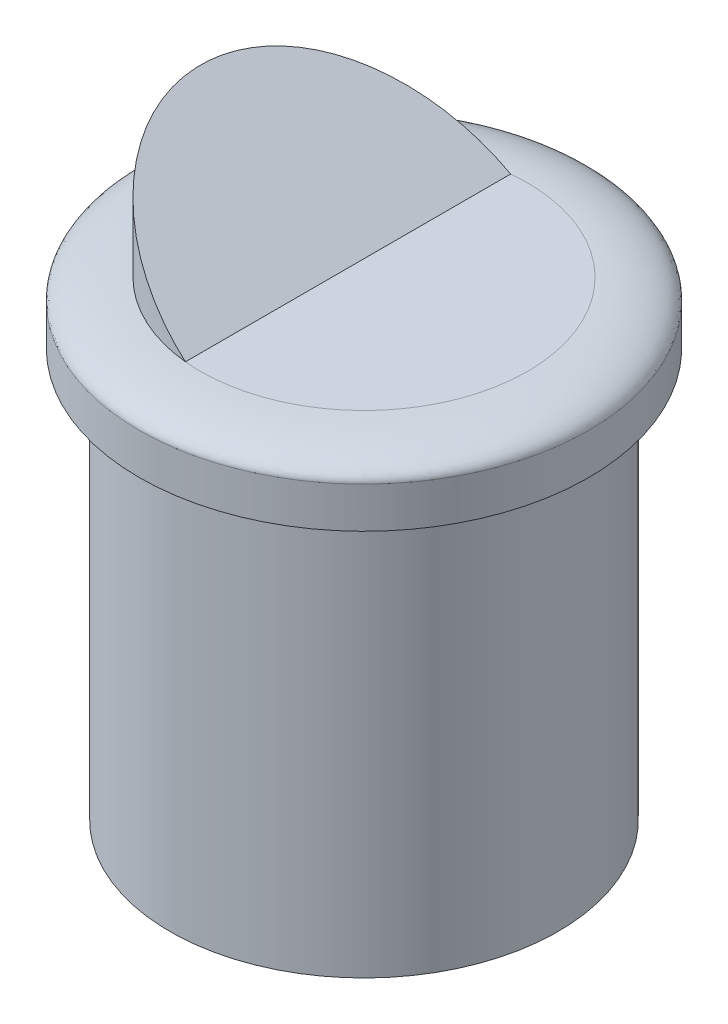
ISO-10303-21;
HEADER;
FILE_DESCRIPTION(('STEP AP214'),'2;1');
FILE_NAME('part.step','',(''),(''),'','','');
FILE_SCHEMA(('AUTOMOTIVE_DESIGN { 1 0 10303 214 1 1 1 1 }'));
ENDSEC;
DATA;
#1=APPLICATION_CONTEXT('core data for automotive mechanical design processes');
#2=APPLICATION_PROTOCOL_DEFINITION('international standard','automotive_design',2000,#1);
#3=PRODUCT_CONTEXT('',#1,'mechanical');
#4=PRODUCT('Part','Part','',(#3));
#5=PRODUCT_RELATED_PRODUCT_CATEGORY('part','',(#4));
#6=PRODUCT_DEFINITION_FORMATION('','',#4);
#7=PRODUCT_DEFINITION_CONTEXT('part definition',#1,'design');
#8=PRODUCT_DEFINITION('design','',#6,#7);
#9=PRODUCT_DEFINITION_SHAPE('','',#8);
#10=(LENGTH_UNIT() NAMED_UNIT(*) SI_UNIT(.MILLI.,.METRE.));
#11=(NAMED_UNIT(*) PLANE_ANGLE_UNIT() SI_UNIT($,.RADIAN.));
#12=(NAMED_UNIT(*) SI_UNIT($,.STERADIAN.) SOLID_ANGLE_UNIT());
#13=UNCERTAINTY_MEASURE_WITH_UNIT(LENGTH_MEASURE(1.E-05),#10,'distance_accuracy_value','');
#14=(GEOMETRIC_REPRESENTATION_CONTEXT(3) GLOBAL_UNCERTAINTY_ASSIGNED_CONTEXT((#13)) GLOBAL_UNIT_ASSIGNED_CONTEXT((#10,
#11,#12)) REPRESENTATION_CONTEXT('',''));
#15=CARTESIAN_POINT('',(0.,0.,0.));
#16=DIRECTION('',(0.,0.,1.));
#17=DIRECTION('',(1.,0.,0.));
#18=AXIS2_PLACEMENT_3D('',#15,#16,#17);
#19=CARTESIAN_POINT('',(0.,8.,8.));
#20=CARTESIAN_POINT('',(0.523594432108136,8.,8.));
#21=CARTESIAN_POINT('',(1.57078329632441,8.,7.89686089918334));
#22=CARTESIAN_POINT('',(3.0812022714765,8.,7.43868031221336));
#23=CARTESIAN_POINT('',(4.47321237129389,8.,6.69463541250499));
#24=CARTESIAN_POINT('',(5.69331942828885,8.,5.69331942828885));
#25=CARTESIAN_POINT('',(6.69463541250499,8.,4.47321237129389));
#26=CARTESIAN_POINT('',(7.43868031221336,8.,3.0812022714765));
#27=CARTESIAN_POINT('',(7.89686089918334,8.,1.57078329632441));
#28=CARTESIAN_POINT('',(8.05156955040833,8.,0.));
#29=CARTESIAN_POINT('',(7.89686089918334,8.,-1.57078329632441));
#30=CARTESIAN_POINT('',(7.43868031221336,8.,-3.0812022714765));
#31=CARTESIAN_POINT('',(6.69463541250499,8.,-4.47321237129389));
#32=CARTESIAN_POINT('',(5.69331942828885,8.,-5.69331942828885));
#33=CARTESIAN_POINT('',(4.47321237129389,8.,-6.69463541250499));
#34=CARTESIAN_POINT('',(3.08120227147651,8.,-7.43868031221335));
#35=CARTESIAN_POINT('',(1.57078329632442,8.,-7.89686089918335));
#36=CARTESIAN_POINT('',(0.,8.,-8.05156955040833));
#37=CARTESIAN_POINT('',(-1.57078329632441,8.,-7.89686089918335));
#38=CARTESIAN_POINT('',(-3.08120227147649,8.,-7.43868031221336));
#39=CARTESIAN_POINT('',(-4.47321237129389,8.,-6.69463541250499));
#40=CARTESIAN_POINT('',(-5.69331942828885,8.,-5.69331942828886));
#41=CARTESIAN_POINT('',(-6.69463541250499,8.,-4.47321237129389));
#42=CARTESIAN_POINT('',(-7.43868031221335,8.,-3.08120227147651));
#43=CARTESIAN_POINT('',(-7.89686089918334,8.,-1.57078329632442));
#44=CARTESIAN_POINT('',(-8.05156955040833,8.,0.));
#45=CARTESIAN_POINT('',(-7.89686089918334,8.,1.57078329632441));
#46=CARTESIAN_POINT('',(-7.43868031221336,8.,3.08120227147649));
#47=CARTESIAN_POINT('',(-6.694635412505,8.,4.47321237129388));
#48=CARTESIAN_POINT('',(-5.69331942828886,8.,5.69331942828884));
#49=CARTESIAN_POINT('',(-4.4732123712939,8.,6.69463541250498));
#50=CARTESIAN_POINT('',(-3.08120227147651,8.,7.43868031221335));
#51=CARTESIAN_POINT('',(-1.57078329632442,8.,7.89686089918334));
#52=CARTESIAN_POINT('',(-0.523594432108142,8.,8.));
#53=CARTESIAN_POINT('',(0.,8.,8.));
#54=B_SPLINE_CURVE_WITH_KNOTS('',3,(#19,#20,#21,#22,#23,#24,#25,#26,#27,#28,#29,#30,#31,#32,#33,
#34,#35,#36,#37,#38,#39,#40,#41,#42,#43,#44,#45,#46,#47,#48,#49,#50,#51,#52,#53),.UNSPECIFIED.,
.T.,.F.,(4,1,1,1,1,1,1,1,1,1,1,1,1,1,1,1,1,1,1,1,1,1,1,1,1,1,1,1,1,1,1,1,4),(0.,0.03125,0.0625,
0.0937500000000001,0.125,0.15625,0.1875,0.21875,0.25,0.28125,0.3125,0.34375,0.375,0.40625,
0.4375,0.46875,0.5,0.53125,0.5625,0.59375,0.625,0.65625,0.6875,0.71875,0.75,0.78125,0.8125,
0.84375,0.874999999999999,0.90625,0.9375,0.96875,1.),.UNSPECIFIED.);
#55=DIRECTION('',(0.,-1.,0.));
#56=VECTOR('',#55,1.);
#57=SURFACE_OF_LINEAR_EXTRUSION('',#54,#56);
#58=CARTESIAN_POINT('',(-0.781249971337208,2.99999999199395,-7.96173023071898));
#59=CARTESIAN_POINT('',(-1.05983318932956,3.19295805614418,-7.93443036396187));
#60=CARTESIAN_POINT('',(-1.33738145613317,3.38519927751295,-7.89244490433764));
#61=CARTESIAN_POINT('',(-1.7507289959594,3.67150060299282,-7.80734674406256));
#62=CARTESIAN_POINT('',(-1.88809350591798,3.76664485251016,-7.77526931205513));
#63=CARTESIAN_POINT('',(-2.16156102919862,3.95605958739748,-7.70371223515596));
#64=CARTESIAN_POINT('',(-2.29766356768166,4.05032974387453,-7.66422991390998));
#65=CARTESIAN_POINT('',(-2.70500357170828,4.33247000632624,-7.53419239511782));
#66=CARTESIAN_POINT('',(-2.97387058203079,4.51869823862229,-7.43233331086708));
#67=CARTESIAN_POINT('',(-3.50261122017693,4.88492552048263,-7.19827893369575));
#68=CARTESIAN_POINT('',(-3.76248297199151,5.0649232706467,-7.06607735603461));
#69=CARTESIAN_POINT('',(-4.21065496679196,5.37534543154175,-6.80591837849726));
#70=CARTESIAN_POINT('',(-4.40143331401228,5.50748627810308,-6.68425272559385));
#71=CARTESIAN_POINT('',(-4.7744471062082,5.76585080949552,-6.42310815461508));
#72=CARTESIAN_POINT('',(-4.95668765868172,5.89207803198751,-6.28364007726818));
#73=CARTESIAN_POINT('',(-5.31075729480683,6.1373210699959,-5.98736685105487));
#74=CARTESIAN_POINT('',(-5.48261037610058,6.25635350725576,-5.83060422746779));
#75=CARTESIAN_POINT('',(-5.81456043212906,6.48627562398554,-5.49961774751076));
#76=CARTESIAN_POINT('',(-5.97465921511366,6.59716655592289,-5.32539658670884));
#77=CARTESIAN_POINT('',(-6.25598580285226,6.79202479851238,-4.9901704627372));
#78=CARTESIAN_POINT('',(-6.37927202295946,6.87741785140049,-4.83171721696711));
#79=CARTESIAN_POINT('',(-6.61516789868493,7.04080893415407,-4.50337133706685));
#80=CARTESIAN_POINT('',(-6.72777576806597,7.11880572679894,-4.33347679717698));
#81=CARTESIAN_POINT('',(-6.9410533720938,7.26653047417752,-3.98290409883784));
#82=CARTESIAN_POINT('',(-7.04172246152095,7.33625798200585,-3.80222535835957));
#83=CARTESIAN_POINT('',(-7.22990393366225,7.46660012721195,-3.43095316392411));
#84=CARTESIAN_POINT('',(-7.31741537589943,7.5272141131771,-3.24035900254582));
#85=CARTESIAN_POINT('',(-7.47853015368886,7.63880876445982,-2.84897543609769));
#86=CARTESIAN_POINT('',(-7.55203249107007,7.68971947433425,-2.64812432548509));
#87=CARTESIAN_POINT('',(-7.68325122285704,7.78060690760661,-2.23902543123713));
#88=CARTESIAN_POINT('',(-7.74097545884572,7.82058906240396,-2.03078138018914));
#89=CARTESIAN_POINT('',(-7.83960907483111,7.88890671849774,-1.6085533316257));
#90=CARTESIAN_POINT('',(-7.88052509265571,7.91724681742387,-1.39457163562901));
#91=CARTESIAN_POINT('',(-7.94483120776332,7.96178784953303,-0.962755659348785));
#92=CARTESIAN_POINT('',(-7.96822361216889,7.97799038072304,-0.744921890088118));
#93=CARTESIAN_POINT('',(-7.99535244986146,7.99678091765296,-0.333642249517576));
#94=CARTESIAN_POINT('',(-8.00110204504561,8.00076332124371,-0.140389448677632));
#95=CARTESIAN_POINT('',(-7.99854855829835,7.99899467241444,0.245968278848346));
#96=CARTESIAN_POINT('',(-7.9902467502307,7.99324450232429,0.43907321735142));
#97=CARTESIAN_POINT('',(-7.95979321873374,7.97215114717489,0.823612018410726));
#98=CARTESIAN_POINT('',(-7.93764434634011,7.95680993685895,1.01504621673837));
#99=CARTESIAN_POINT('',(-7.87979404165224,7.91674046175047,1.39485830500734));
#100=CARTESIAN_POINT('',(-7.84409252815692,7.89201214071475,1.58323617662953));
#101=CARTESIAN_POINT('',(-7.76118097156111,7.83458422272631,1.94876808051231));
#102=CARTESIAN_POINT('',(-7.7144405857692,7.80220992953711,2.12608044870308));
#103=CARTESIAN_POINT('',(-7.60947833277132,7.72950880191953,2.47560525108498));
#104=CARTESIAN_POINT('',(-7.55125579377227,7.68918150217993,2.64781738619539));
#105=CARTESIAN_POINT('',(-7.42396126151904,7.60101212919067,2.9862090129559));
#106=CARTESIAN_POINT('',(-7.35488835062146,7.55316942034387,3.15238799290206));
#107=CARTESIAN_POINT('',(-7.2066422488103,7.45048813770411,3.47793277516508));
#108=CARTESIAN_POINT('',(-7.12746851484967,7.39564918777466,3.63729821055222));
#109=CARTESIAN_POINT('',(-6.9530785743952,7.27485961862871,3.96114906680818));
#110=CARTESIAN_POINT('',(-6.85708407491632,7.20836992201997,4.12501429524531));
#111=CARTESIAN_POINT('',(-6.65518477639779,7.06852625205042,4.44342925310623));
#112=CARTESIAN_POINT('',(-6.5492795663672,6.99517199402057,4.59797859576876));
#113=CARTESIAN_POINT('',(-6.32850961837669,6.84225774433017,4.89736273436997));
#114=CARTESIAN_POINT('',(-6.21364273690226,6.76269626798425,5.04219519065384));
#115=CARTESIAN_POINT('',(-5.97595237234772,6.59806224924518,5.32177577181967));
#116=CARTESIAN_POINT('',(-5.85312850145365,6.51298943823629,5.45652340448874));
#117=CARTESIAN_POINT('',(-5.43504808086235,6.22340992613842,5.8851224007111));
#118=CARTESIAN_POINT('',(-5.12410524437662,6.00803826450329,6.1569094603228));
#119=CARTESIAN_POINT('',(-4.6368054048119,5.67051456610348,6.52236410486214));
#120=CARTESIAN_POINT('',(-4.47073906547335,5.55549026179972,6.63722538195602));
#121=CARTESIAN_POINT('',(-4.13254679978052,5.32124453664452,6.85288850093248));
#122=CARTESIAN_POINT('',(-3.96042239896079,5.20202417244038,6.95369385108465));
#123=CARTESIAN_POINT('',(-3.57958753291725,4.93824244704225,7.15827032155413));
#124=CARTESIAN_POINT('',(-3.36988050496343,4.7929908259487,7.25929332948643));
#125=CARTESIAN_POINT('',(-2.94479073267973,4.49855635163965,7.44189046421427));
#126=CARTESIAN_POINT('',(-2.72940690142165,4.34937274557344,7.52346083595931));
#127=CARTESIAN_POINT('',(-2.29464985884918,4.04824232647562,7.66723045253112));
#128=CARTESIAN_POINT('',(-2.07528262717656,3.89629965518722,7.72945654179938));
#129=CARTESIAN_POINT('',(-1.63345500429258,3.59027186444509,7.83474917096958));
#130=CARTESIAN_POINT('',(-1.41099456889493,3.43618671438614,7.87781543688356));
#131=CARTESIAN_POINT('',(-1.05244428416326,3.18784019682309,7.93162650010762));
#132=CARTESIAN_POINT('',(-0.916953644910557,3.09399386660475,7.94841874515563));
#133=CARTESIAN_POINT('',(-0.781250000000001,3.,7.96173022736226));
#134=B_SPLINE_CURVE_WITH_KNOTS('',3,(#58,#59,#60,#61,#62,#63,#64,#65,#66,#67,#68,#69,#70,#71,
#72,#73,#74,#75,#76,#77,#78,#79,#80,#81,#82,#83,#84,#85,#86,#87,#88,#89,#90,#91,#92,#93,#94,#95,
#96,#97,#98,#99,#100,#101,#102,#103,#104,#105,#106,#107,#108,#109,#110,#111,#112,#113,#114,#115,
#116,#117,#118,#119,#120,#121,#122,#123,#124,#125,#126,#127,#128,#129,#130,#131,#132,#133),
.UNSPECIFIED.,.F.,.F.,(4,2,2,2,2,2,2,2,2,2,2,2,2,2,2,2,2,2,2,2,2,2,2,2,2,2,2,2,2,2,2,2,2,2,2,2,
2,4),(0.,1.01940558390044,1.52969313399213,2.04016547433843,3.06628254226692,4.09261233854828,
4.87796221527417,5.66283611707719,6.44582139751449,7.22868597209726,7.88256869702017,
8.53656060892714,9.19058784909374,9.84466181535255,10.5032863442335,11.1615829446546,
11.8196193229651,12.4775690503386,13.0569722300081,13.6363228853016,14.2155542946951,
14.7947891746271,15.3527985972999,15.9108406774493,16.4689299780633,17.0270492956932,
17.6300869827793,18.2331496885499,18.8363570838748,19.4395939009431,20.8307310728213,
21.5275015090555,22.2240977233404,23.0464122634508,23.8688854112514,24.6902120486247,
25.5115504306986,26.0084031640616),.UNSPECIFIED.);
#135=CARTESIAN_POINT('',(-0.781249999999999,3.,-7.96173023071898));
#136=VERTEX_POINT('',#135);
#137=CARTESIAN_POINT('',(-0.781249999999999,3.,7.96173022736226));
#138=VERTEX_POINT('',#137);
#139=EDGE_CURVE('E74',#136,#138,#134,.T.);
#140=ORIENTED_EDGE('',*,*,#139,.F.);
#141=CARTESIAN_POINT('',(-0.781249999999995,3.,-7.96173022736226));
#142=CARTESIAN_POINT('',(-1.04276025917768,3.,-7.93606920630819));
#143=CARTESIAN_POINT('',(-1.82159093824238,3.,-7.82077923278415));
#144=CARTESIAN_POINT('',(-3.08120227147649,3.,-7.43868031221336));
#145=CARTESIAN_POINT('',(-4.47321237129389,3.,-6.69463541250499));
#146=CARTESIAN_POINT('',(-5.69331942828885,3.,-5.69331942828886));
#147=CARTESIAN_POINT('',(-6.69463541250499,3.,-4.47321237129389));
#148=CARTESIAN_POINT('',(-7.43868031221335,3.,-3.08120227147651));
#149=CARTESIAN_POINT('',(-7.89686089918334,3.,-1.57078329632442));
#150=CARTESIAN_POINT('',(-8.05156955040833,3.,0.));
#151=CARTESIAN_POINT('',(-7.89686089918334,3.,1.57078329632441));
#152=CARTESIAN_POINT('',(-7.43868031221336,3.,3.08120227147649));
#153=CARTESIAN_POINT('',(-6.694635412505,3.,4.47321237129388));
#154=CARTESIAN_POINT('',(-5.69331942828886,3.,5.69331942828884));
#155=CARTESIAN_POINT('',(-4.4732123712939,3.,6.69463541250498));
#156=CARTESIAN_POINT('',(-3.08120227147651,3.,7.43868031221335));
#157=CARTESIAN_POINT('',(-1.82159093824238,3.,7.82077923278415));
#158=CARTESIAN_POINT('',(-1.04276025917768,3.,7.93606920630819));
#159=CARTESIAN_POINT('',(-0.781249999999995,3.,7.96173022736226));
#160=B_SPLINE_CURVE_WITH_KNOTS('',3,(#141,#142,#143,#144,#145,#146,#147,#148,#149,#150,#151,
#152,#153,#154,#155,#156,#157,#158,#159),.UNSPECIFIED.,.F.,.F.,(4,1,1,1,1,1,1,1,1,1,1,1,1,1,1,1,
4),(0.515567347084899,0.53125,0.5625,0.59375,0.625,0.65625,0.6875,0.71875,0.75,0.78125,0.8125,
0.84375,0.874999999999999,0.90625,0.9375,0.96875,0.984432652915101),.UNSPECIFIED.);
#161=EDGE_CURVE('E82',#136,#138,#160,.T.);
#162=ORIENTED_EDGE('',*,*,#161,.T.);
#163=EDGE_LOOP('',(#140,#162));
#164=FACE_BOUND('',#163,.T.);
#165=ADVANCED_FACE('F46',(#164),#57,.F.);
#166=CARTESIAN_POINT('',(0.,3.,0.));
#167=DIRECTION('',(0.,-1.,0.));
#168=DIRECTION('',(0.,0.,-1.));
#169=AXIS2_PLACEMENT_3D('',#166,#167,#168);
#170=CYLINDRICAL_SURFACE('',#169,11.);
#171=CARTESIAN_POINT('',(0.,2.,11.));
#172=CARTESIAN_POINT('',(0.719948314572662,2.,11.));
#173=CARTESIAN_POINT('',(1.43987883259325,2.,10.9290930329605));
#174=CARTESIAN_POINT('',(2.85210825176158,2.,10.6481831359105));
#175=CARTESIAN_POINT('',(3.54437224371586,2.,10.4381871497705));
#176=CARTESIAN_POINT('',(4.87466326831612,2.,9.88716256547784));
#177=CARTESIAN_POINT('',(5.51265741721982,2.,9.54614758821734));
#178=CARTESIAN_POINT('',(6.70988770921143,2.,8.74618388243866));
#179=CARTESIAN_POINT('',(7.26909425771401,2.,8.28725492839004));
#180=CARTESIAN_POINT('',(8.28725492839004,2.,7.26909425771401));
#181=CARTESIAN_POINT('',(8.7461838824388,2.,6.70988770921122));
#182=CARTESIAN_POINT('',(9.5461475882172,2.,5.51265741722003));
#183=CARTESIAN_POINT('',(9.88716256547795,2.,4.87466326831586));
#184=CARTESIAN_POINT('',(10.4381871497704,2.,3.5443722437161));
#185=CARTESIAN_POINT('',(10.6481831359106,2.,2.85210825176148));
#186=CARTESIAN_POINT('',(10.9290930329605,2.,1.43987883259336));
#187=CARTESIAN_POINT('',(11.,2.,0.719948314572796));
#188=CARTESIAN_POINT('',(11.,2.,-0.719948314572795));
#189=CARTESIAN_POINT('',(10.9290930329605,2.,-1.43987883259317));
#190=CARTESIAN_POINT('',(10.6481831359105,2.,-2.85210825176164));
#191=CARTESIAN_POINT('',(10.4381871497704,2.,-3.54437224371608));
#192=CARTESIAN_POINT('',(9.88716256547793,2.,-4.8746632683159));
#193=CARTESIAN_POINT('',(9.54614758821744,2.,-5.51265741721967));
#194=CARTESIAN_POINT('',(8.74618388243857,2.,-6.70988770921157));
#195=CARTESIAN_POINT('',(8.28725492839027,2.,-7.26909425771378));
#196=CARTESIAN_POINT('',(7.26909425771377,2.,-8.28725492839028));
#197=CARTESIAN_POINT('',(6.70988770921122,2.,-8.7461838824388));
#198=CARTESIAN_POINT('',(5.51265741722005,2.,-9.54614758821719));
#199=CARTESIAN_POINT('',(4.87466326831583,2.,-9.88716256547796));
#200=CARTESIAN_POINT('',(3.54437224371618,2.,-10.4381871497703));
#201=CARTESIAN_POINT('',(2.85210825176171,2.,-10.6481831359105));
#202=CARTESIAN_POINT('',(1.43987883259312,2.,-10.9290930329605));
#203=CARTESIAN_POINT('',(0.719948314572798,2.,-11.));
#204=CARTESIAN_POINT('',(-0.719948314572795,2.,-11.));
#205=CARTESIAN_POINT('',(-1.43987883259322,2.,-10.9290930329605));
#206=CARTESIAN_POINT('',(-2.85210825176159,2.,-10.6481831359105));
#207=CARTESIAN_POINT('',(-3.54437224371634,2.,-10.4381871497703));
#208=CARTESIAN_POINT('',(-4.87466326831561,2.,-9.88716256547805));
#209=CARTESIAN_POINT('',(-5.51265741721987,2.,-9.5461475882173));
#210=CARTESIAN_POINT('',(-6.70988770921136,2.,-8.74618388243871));
#211=CARTESIAN_POINT('',(-7.2690942577139,2.,-8.28725492839015));
#212=CARTESIAN_POINT('',(-8.28725492839016,2.,-7.26909425771388));
#213=CARTESIAN_POINT('',(-8.74618388243899,2.,-6.70988770921094));
#214=CARTESIAN_POINT('',(-9.546147588217,2.,-5.51265741722033));
#215=CARTESIAN_POINT('',(-9.88716256547792,2.,-4.87466326831593));
#216=CARTESIAN_POINT('',(-10.4381871497704,2.,-3.54437224371607));
#217=CARTESIAN_POINT('',(-10.6481831359106,2.,-2.85210825176154));
#218=CARTESIAN_POINT('',(-10.9290930329605,2.,-1.43987883259331));
#219=CARTESIAN_POINT('',(-11.,2.,-0.719948314572779));
#220=CARTESIAN_POINT('',(-11.,2.,0.719948314572814));
#221=CARTESIAN_POINT('',(-10.9290930329605,2.,1.4398788325932));
#222=CARTESIAN_POINT('',(-10.6481831359105,2.,2.85210825176161));
#223=CARTESIAN_POINT('',(-10.4381871497704,2.,3.54437224371604));
#224=CARTESIAN_POINT('',(-9.88716256547793,2.,4.8746632683159));
#225=CARTESIAN_POINT('',(-9.54614758821725,2.,5.51265741721995));
#226=CARTESIAN_POINT('',(-8.74618388243875,2.,6.70988770921129));
#227=CARTESIAN_POINT('',(-8.28725492839051,2.,7.26909425771353));
#228=CARTESIAN_POINT('',(-7.26909425771358,2.,8.28725492839047));
#229=CARTESIAN_POINT('',(-6.70988770921115,2.,8.74618388243884));
#230=CARTESIAN_POINT('',(-5.51265741722012,2.,9.54614758821714));
#231=CARTESIAN_POINT('',(-4.87466326831593,2.,9.88716256547792));
#232=CARTESIAN_POINT('',(-3.54437224371607,2.,10.4381871497704));
#233=CARTESIAN_POINT('',(-2.85210825176154,2.,10.6481831359106));
#234=CARTESIAN_POINT('',(-1.43987883259331,2.,10.9290930329605));
#235=CARTESIAN_POINT('',(-0.719948314572663,2.,11.));
#236=CARTESIAN_POINT('',(0.,2.,11.));
#237=(BOUNDED_CURVE() B_SPLINE_CURVE(3,(#171,#172,#173,#174,#175,#176,#177,#178,#179,#180,#181,
#182,#183,#184,#185,#186,#187,#188,#189,#190,#191,#192,#193,#194,#195,#196,#197,#198,#199,#200,
#201,#202,#203,#204,#205,#206,#207,#208,#209,#210,#211,#212,#213,#214,#215,#216,#217,#218,#219,
#220,#221,#222,#223,#224,#225,#226,#227,#228,#229,#230,#231,#232,#233,#234,#235,#236),
.UNSPECIFIED.,.T.,.F.) B_SPLINE_CURVE_WITH_KNOTS((4,2,2,2,2,2,2,2,2,2,2,2,2,2,2,2,2,2,2,2,2,2,2,
2,2,2,2,2,2,2,2,2,4),(0.,0.196349540849362,0.392699081698724,0.589048622548086,
0.785398163397448,0.98174770424681,1.17809724509617,1.37444678594553,1.5707963267949,
1.76714586764426,1.96349540849362,2.15984494934298,2.35619449019234,2.55254403104171,
2.74889357189107,2.94524311274043,3.14159265358979,3.33794219443916,3.53429173528852,
3.73064127613788,3.92699081698724,4.1233403578366,4.31968989868597,4.51603943953533,
4.71238898038469,4.90873852123405,5.10508806208341,5.30143760293278,5.49778714378214,
5.6941366846315,5.89048622548086,6.08683576633022,6.28318530717959),
.UNSPECIFIED.) CURVE() GEOMETRIC_REPRESENTATION_ITEM() RATIONAL_B_SPLINE_CURVE((1.,1.,1.,1.,1.,
1.,1.,1.,1.,1.,1.,1.,1.,1.,1.,1.,1.,1.,1.,1.,1.,1.,1.,1.,1.,1.,1.,1.,1.,1.,1.,1.,1.,1.,1.,1.,1.,
1.,1.,1.,1.,1.,1.,1.,1.,1.,1.,1.,1.,1.,1.,1.,1.,1.,1.,1.,1.,1.,1.,1.,1.,1.,1.,1.,1.,1.)) REPRESENTATION_ITEM(''));
#238=CARTESIAN_POINT('',(0.,2.,11.));
#239=VERTEX_POINT('',#238);
#240=EDGE_CURVE('E12',#239,#239,#237,.F.);
#241=ORIENTED_EDGE('',*,*,#240,.T.);
#242=EDGE_LOOP('',(#241));
#243=FACE_BOUND('',#242,.T.);
#244=CARTESIAN_POINT('',(0.,0.,0.));
#245=DIRECTION('',(0.,1.,0.));
#246=DIRECTION('',(0.,0.,1.));
#247=AXIS2_PLACEMENT_3D('',#244,#245,#246);
#248=CIRCLE('',#247,11.);
#249=CARTESIAN_POINT('',(0.,0.,11.));
#250=VERTEX_POINT('',#249);
#251=EDGE_CURVE('E119',#250,#250,#248,.T.);
#252=ORIENTED_EDGE('',*,*,#251,.T.);
#253=EDGE_LOOP('',(#252));
#254=FACE_BOUND('',#253,.T.);
#255=ADVANCED_FACE('F116',(#243,#254),#170,.T.);
#256=CARTESIAN_POINT('',(0.,0.,0.));
#257=DIRECTION('',(0.,1.,0.));
#258=DIRECTION('',(0.,0.,1.));
#259=AXIS2_PLACEMENT_3D('',#256,#257,#258);
#260=PLANE('',#259);
#261=CARTESIAN_POINT('',(0.,0.,0.));
#262=DIRECTION('',(0.,-1.,0.));
#263=DIRECTION('',(0.,0.,-1.));
#264=AXIS2_PLACEMENT_3D('',#261,#262,#263);
#265=CIRCLE('',#264,9.5);
#266=CARTESIAN_POINT('',(0.,0.,-9.5));
#267=VERTEX_POINT('',#266);
#268=EDGE_CURVE('E168',#267,#267,#265,.T.);
#269=ORIENTED_EDGE('',*,*,#268,.F.);
#270=EDGE_LOOP('',(#269));
#271=FACE_BOUND('',#270,.T.);
#272=ORIENTED_EDGE('',*,*,#251,.F.);
#273=EDGE_LOOP('',(#272));
#274=FACE_BOUND('',#273,.T.);
#275=ADVANCED_FACE('F131',(#271,#274),#260,.F.);
#276=CARTESIAN_POINT('',(0.,-20.,0.));
#277=DIRECTION('',(0.,1.,0.));
#278=DIRECTION('',(0.,0.,1.));
#279=AXIS2_PLACEMENT_3D('',#276,#277,#278);
#280=CYLINDRICAL_SURFACE('',#279,9.5);
#281=CARTESIAN_POINT('',(0.,-20.,0.));
#282=DIRECTION('',(0.,-1.,0.));
#283=DIRECTION('',(0.,0.,-1.));
#284=AXIS2_PLACEMENT_3D('',#281,#282,#283);
#285=CIRCLE('',#284,9.5);
#286=CARTESIAN_POINT('',(0.,-20.,-9.5));
#287=VERTEX_POINT('',#286);
#288=EDGE_CURVE('E90',#287,#287,#285,.T.);
#289=ORIENTED_EDGE('',*,*,#288,.F.);
#290=EDGE_LOOP('',(#289));
#291=FACE_BOUND('',#290,.T.);
#292=ORIENTED_EDGE('',*,*,#268,.T.);
#293=EDGE_LOOP('',(#292));
#294=FACE_BOUND('',#293,.T.);
#295=ADVANCED_FACE('F134',(#291,#294),#280,.T.);
#296=CARTESIAN_POINT('',(0.,-20.,0.));
#297=DIRECTION('',(0.,-1.,0.));
#298=DIRECTION('',(0.,0.,-1.));
#299=AXIS2_PLACEMENT_3D('',#296,#297,#298);
#300=PLANE('',#299);
#301=ORIENTED_EDGE('',*,*,#288,.T.);
#302=EDGE_LOOP('',(#301));
#303=FACE_BOUND('',#302,.T.);
#304=ADVANCED_FACE('F138',(#303),#300,.T.);
#305=CARTESIAN_POINT('',(0.,3.,8.));
#306=CARTESIAN_POINT('',(0.523598774234663,3.,8.));
#307=CARTESIAN_POINT('',(1.04718460552236,3.,7.94843129669841));
#308=CARTESIAN_POINT('',(2.0742605467357,3.,7.74413318975327));
#309=CARTESIAN_POINT('',(2.57772526815718,3.,7.59140883619663));
#310=CARTESIAN_POINT('',(3.54520964968425,3.,7.19066368398396));
#311=CARTESIAN_POINT('',(4.00920539434182,3.,6.94265279143079));
#312=CARTESIAN_POINT('',(4.87991833397182,3.,6.36086100540994));
#313=CARTESIAN_POINT('',(5.28661400561004,3.,6.02709449337449));
#314=CARTESIAN_POINT('',(6.02709449337472,3.,5.28661400561027));
#315=CARTESIAN_POINT('',(6.36086100540994,3.,4.87991833397182));
#316=CARTESIAN_POINT('',(6.94265279143079,3.,4.00920539434182));
#317=CARTESIAN_POINT('',(7.19066368398387,3.,3.54520964968424));
#318=CARTESIAN_POINT('',(7.59140883619672,3.,2.57772526815719));
#319=CARTESIAN_POINT('',(7.74413318975323,3.,2.0742605467357));
#320=CARTESIAN_POINT('',(7.94843129669846,3.,1.04718460552236));
#321=CARTESIAN_POINT('',(8.,3.,0.523598774234761));
#322=CARTESIAN_POINT('',(8.,3.,-0.52359877423476));
#323=CARTESIAN_POINT('',(7.94843129669892,3.,-1.04718460552241));
#324=CARTESIAN_POINT('',(7.74413318975277,3.,-2.07426054673563));
#325=CARTESIAN_POINT('',(7.59140883619649,3.,-2.57772526815709));
#326=CARTESIAN_POINT('',(7.1906636839841,3.,-3.54520964968436));
#327=CARTESIAN_POINT('',(6.94265279143099,3.,-4.00920539434174));
#328=CARTESIAN_POINT('',(6.36086100540974,3.,-4.87991833397188));
#329=CARTESIAN_POINT('',(6.02709449337461,3.,-5.28661400561015));
#330=CARTESIAN_POINT('',(5.28661400561014,3.,-6.02709449337462));
#331=CARTESIAN_POINT('',(4.87991833397189,3.,-6.36086100541019));
#332=CARTESIAN_POINT('',(4.00920539434175,3.,-6.94265279143053));
#333=CARTESIAN_POINT('',(3.54520964968419,3.,-7.190663683984));
#334=CARTESIAN_POINT('',(2.57772526815727,3.,-7.59140883619658));
#335=CARTESIAN_POINT('',(2.0742605467357,3.,-7.74413318975296));
#336=CARTESIAN_POINT('',(1.04718460552237,3.,-7.94843129669873));
#337=CARTESIAN_POINT('',(0.523598774234762,3.,-8.));
#338=CARTESIAN_POINT('',(-0.52359877423476,3.,-8.));
#339=CARTESIAN_POINT('',(-1.04718460552241,3.,-7.94843129669873));
#340=CARTESIAN_POINT('',(-2.07426054673563,3.,-7.74413318975296));
#341=CARTESIAN_POINT('',(-2.57772526815725,3.,-7.59140883619659));
#342=CARTESIAN_POINT('',(-3.54520964968416,3.,-7.19066368398401));
#343=CARTESIAN_POINT('',(-4.00920539434174,3.,-6.94265279143076));
#344=CARTESIAN_POINT('',(-4.87991833397188,3.,-6.36086100540997));
#345=CARTESIAN_POINT('',(-5.28661400561037,3.,-6.02709449337461));
#346=CARTESIAN_POINT('',(-6.02709449337439,3.,-5.28661400561014));
#347=CARTESIAN_POINT('',(-6.36086100541029,3.,-4.87991833397185));
#348=CARTESIAN_POINT('',(-6.94265279143042,3.,-4.0092053943418));
#349=CARTESIAN_POINT('',(-7.19066368398397,3.,-3.5452096496842));
#350=CARTESIAN_POINT('',(-7.59140883619661,3.,-2.57772526815726));
#351=CARTESIAN_POINT('',(-7.74413318975304,3.,-2.07426054673565));
#352=CARTESIAN_POINT('',(-7.94843129669864,3.,-1.04718460552242));
#353=CARTESIAN_POINT('',(-8.,3.,-0.523598774234748));
#354=CARTESIAN_POINT('',(-8.,3.,0.523598774234774));
#355=CARTESIAN_POINT('',(-7.94843129669864,3.,1.0471846055224));
#356=CARTESIAN_POINT('',(-7.74413318975305,3.,2.07426054673564));
#357=CARTESIAN_POINT('',(-7.59140883619662,3.,2.57772526815723));
#358=CARTESIAN_POINT('',(-7.19066368398398,3.,3.54520964968418));
#359=CARTESIAN_POINT('',(-6.94265279143088,3.,4.00920539434202));
#360=CARTESIAN_POINT('',(-6.36086100540984,3.,4.87991833397161));
#361=CARTESIAN_POINT('',(-6.02709449337504,3.,5.28661400560995));
#362=CARTESIAN_POINT('',(-5.28661400560975,3.,6.02709449337478));
#363=CARTESIAN_POINT('',(-4.87991833397162,3.,6.36086100541006));
#364=CARTESIAN_POINT('',(-4.00920539434203,3.,6.94265279143065));
#365=CARTESIAN_POINT('',(-3.5452096496842,3.,7.19066368398397));
#366=CARTESIAN_POINT('',(-2.57772526815726,3.,7.59140883619661));
#367=CARTESIAN_POINT('',(-2.07426054673566,3.,7.74413318975304));
#368=CARTESIAN_POINT('',(-1.04718460552242,3.,7.94843129669864));
#369=CARTESIAN_POINT('',(-0.523598774234664,3.,8.));
#370=CARTESIAN_POINT('',(0.,3.,8.));
#371=CARTESIAN_POINT('',(0.,3.,11.));
#372=CARTESIAN_POINT('',(0.719948314572662,3.,11.0000000000005));
#373=CARTESIAN_POINT('',(1.43987883259324,3.,10.9290930329605));
#374=CARTESIAN_POINT('',(2.85210825176158,3.,10.6481831359106));
#375=CARTESIAN_POINT('',(3.54437224371621,2.99999999999989,10.4381871497708));
#376=CARTESIAN_POINT('',(4.87466326831576,3.00000000000011,9.88716256547752));
#377=CARTESIAN_POINT('',(5.51265741721997,3.,9.54614758821756));
#378=CARTESIAN_POINT('',(6.70988770921128,3.,8.74618388243843));
#379=CARTESIAN_POINT('',(7.26909425771412,2.99999999999955,8.28725492838993));
#380=CARTESIAN_POINT('',(8.28725492838993,3.00000000000045,7.26909425771412));
#381=CARTESIAN_POINT('',(8.74618388243889,3.,6.70988770921128));
#382=CARTESIAN_POINT('',(9.54614758821711,3.,5.51265741721997));
#383=CARTESIAN_POINT('',(9.88716256547785,3.,4.87466326831583));
#384=CARTESIAN_POINT('',(10.4381871497705,3.,3.54437224371614));
#385=CARTESIAN_POINT('',(10.648183135911,3.,2.85210825176156));
#386=CARTESIAN_POINT('',(10.9290930329601,3.,1.43987883259327));
#387=CARTESIAN_POINT('',(11.,3.,0.719948314572796));
#388=CARTESIAN_POINT('',(11.,3.,-0.719948314572795));
#389=CARTESIAN_POINT('',(10.929093032961,3.,-1.43987883259326));
#390=CARTESIAN_POINT('',(10.6481831359101,3.,-2.85210825176155));
#391=CARTESIAN_POINT('',(10.43818714977,3.00000000000011,-3.54437224371592));
#392=CARTESIAN_POINT('',(9.88716256547831,2.99999999999989,-4.87466326831606));
#393=CARTESIAN_POINT('',(9.54614758821766,3.,-5.51265741721981));
#394=CARTESIAN_POINT('',(8.74618388243834,3.,-6.70988770921142));
#395=CARTESIAN_POINT('',(8.28725492839038,2.99999999999909,-7.2690942577139));
#396=CARTESIAN_POINT('',(7.26909425771366,3.00000000000091,-8.28725492839016));
#397=CARTESIAN_POINT('',(6.70988770921144,3.,-8.74618388243879));
#398=CARTESIAN_POINT('',(5.51265741721983,3.,-9.5461475882172));
#399=CARTESIAN_POINT('',(4.8746632683158,3.00000000000136,-9.88716256547788));
#400=CARTESIAN_POINT('',(3.54437224371621,2.99999999999864,-10.4381871497704));
#401=CARTESIAN_POINT('',(2.85210825176167,3.,-10.6481831359103));
#402=CARTESIAN_POINT('',(1.43987883259317,3.,-10.9290930329608));
#403=CARTESIAN_POINT('',(0.719948314572798,3.,-11.));
#404=CARTESIAN_POINT('',(-0.719948314572795,3.,-11.));
#405=CARTESIAN_POINT('',(-1.43987883259326,3.,-10.9290930329608));
#406=CARTESIAN_POINT('',(-2.85210825176154,3.,-10.6481831359103));
#407=CARTESIAN_POINT('',(-3.5443722437164,2.99999999999988,-10.4381871497704));
#408=CARTESIAN_POINT('',(-4.87466326831554,3.00000000000011,-9.8871625654779));
#409=CARTESIAN_POINT('',(-5.51265741722004,3.00000000000057,-9.54614758821721));
#410=CARTESIAN_POINT('',(-6.7098877092112,2.99999999999943,-8.74618388243879));
#411=CARTESIAN_POINT('',(-7.26909425771412,2.99999999999909,-8.28725492839038));
#412=CARTESIAN_POINT('',(-8.28725492838993,3.00000000000091,-7.26909425771366));
#413=CARTESIAN_POINT('',(-8.74618388243918,3.,-6.70988770921107));
#414=CARTESIAN_POINT('',(-9.5461475882168,3.,-5.5126574172202));
#415=CARTESIAN_POINT('',(-9.88716256547781,3.,-4.87466326831589));
#416=CARTESIAN_POINT('',(-10.4381871497705,3.,-3.54437224371611));
#417=CARTESIAN_POINT('',(-10.6481831359107,3.,-2.85210825176157));
#418=CARTESIAN_POINT('',(-10.9290930329603,3.,-1.43987883259328));
#419=CARTESIAN_POINT('',(-11.,3.,-0.719948314572779));
#420=CARTESIAN_POINT('',(-11.,3.,0.719948314572814));
#421=CARTESIAN_POINT('',(-10.9290930329608,3.,1.43987883259325));
#422=CARTESIAN_POINT('',(-10.6481831359103,3.,2.85210825176155));
#423=CARTESIAN_POINT('',(-10.4381871497705,3.00000000000068,3.54437224371608));
#424=CARTESIAN_POINT('',(-9.88716256547783,2.99999999999932,4.87466326831586));
#425=CARTESIAN_POINT('',(-9.54614758821727,3.00000000000057,5.51265741722019));
#426=CARTESIAN_POINT('',(-8.74618388243873,2.99999999999943,6.70988770921106));
#427=CARTESIAN_POINT('',(-8.28725492839085,3.00000000000091,7.26909425771388));
#428=CARTESIAN_POINT('',(-7.26909425771324,2.99999999999909,8.28725492839012));
#429=CARTESIAN_POINT('',(-6.70988770921107,3.,8.74618388243872));
#430=CARTESIAN_POINT('',(-5.5126574172202,3.,9.54614758821726));
#431=CARTESIAN_POINT('',(-4.87466326831589,3.,9.88716256547781));
#432=CARTESIAN_POINT('',(-3.54437224371611,3.,10.4381871497705));
#433=CARTESIAN_POINT('',(-2.85210825176169,3.,10.6481831359107));
#434=CARTESIAN_POINT('',(-1.43987883259316,3.,10.9290930329603));
#435=CARTESIAN_POINT('',(-0.719948314572663,3.,10.9999999999995));
#436=CARTESIAN_POINT('',(0.,3.,11.));
#437=CARTESIAN_POINT('',(0.,2.,11.));
#438=CARTESIAN_POINT('',(0.719948314572662,2.,11.));
#439=CARTESIAN_POINT('',(1.43987883259325,2.,10.9290930329605));
#440=CARTESIAN_POINT('',(2.85210825176158,2.,10.6481831359105));
#441=CARTESIAN_POINT('',(3.54437224371586,2.,10.4381871497705));
#442=CARTESIAN_POINT('',(4.87466326831612,2.,9.88716256547784));
#443=CARTESIAN_POINT('',(5.51265741721982,2.,9.54614758821734));
#444=CARTESIAN_POINT('',(6.70988770921143,2.,8.74618388243866));
#445=CARTESIAN_POINT('',(7.26909425771401,2.,8.28725492839004));
#446=CARTESIAN_POINT('',(8.28725492839004,2.,7.26909425771401));
#447=CARTESIAN_POINT('',(8.7461838824388,2.,6.70988770921122));
#448=CARTESIAN_POINT('',(9.5461475882172,2.,5.51265741722003));
#449=CARTESIAN_POINT('',(9.88716256547795,2.,4.87466326831586));
#450=CARTESIAN_POINT('',(10.4381871497704,2.,3.5443722437161));
#451=CARTESIAN_POINT('',(10.6481831359106,2.,2.85210825176148));
#452=CARTESIAN_POINT('',(10.9290930329605,2.,1.43987883259336));
#453=CARTESIAN_POINT('',(11.,2.,0.719948314572796));
#454=CARTESIAN_POINT('',(11.,2.,-0.719948314572795));
#455=CARTESIAN_POINT('',(10.9290930329605,2.,-1.43987883259317));
#456=CARTESIAN_POINT('',(10.6481831359105,2.,-2.85210825176164));
#457=CARTESIAN_POINT('',(10.4381871497704,2.,-3.54437224371608));
#458=CARTESIAN_POINT('',(9.88716256547793,2.,-4.8746632683159));
#459=CARTESIAN_POINT('',(9.54614758821744,2.,-5.51265741721967));
#460=CARTESIAN_POINT('',(8.74618388243857,2.,-6.70988770921157));
#461=CARTESIAN_POINT('',(8.28725492839027,2.,-7.26909425771378));
#462=CARTESIAN_POINT('',(7.26909425771377,2.,-8.28725492839028));
#463=CARTESIAN_POINT('',(6.70988770921122,2.,-8.7461838824388));
#464=CARTESIAN_POINT('',(5.51265741722005,2.,-9.54614758821719));
#465=CARTESIAN_POINT('',(4.87466326831583,2.,-9.88716256547796));
#466=CARTESIAN_POINT('',(3.54437224371618,2.,-10.4381871497703));
#467=CARTESIAN_POINT('',(2.85210825176171,2.,-10.6481831359105));
#468=CARTESIAN_POINT('',(1.43987883259312,2.,-10.9290930329605));
#469=CARTESIAN_POINT('',(0.719948314572798,2.,-11.));
#470=CARTESIAN_POINT('',(-0.719948314572795,2.,-11.));
#471=CARTESIAN_POINT('',(-1.43987883259322,2.,-10.9290930329605));
#472=CARTESIAN_POINT('',(-2.85210825176159,2.,-10.6481831359105));
#473=CARTESIAN_POINT('',(-3.54437224371634,2.,-10.4381871497703));
#474=CARTESIAN_POINT('',(-4.87466326831561,2.,-9.88716256547805));
#475=CARTESIAN_POINT('',(-5.51265741721987,2.,-9.5461475882173));
#476=CARTESIAN_POINT('',(-6.70988770921136,2.,-8.74618388243871));
#477=CARTESIAN_POINT('',(-7.2690942577139,2.,-8.28725492839015));
#478=CARTESIAN_POINT('',(-8.28725492839016,2.,-7.26909425771388));
#479=CARTESIAN_POINT('',(-8.74618388243899,2.,-6.70988770921094));
#480=CARTESIAN_POINT('',(-9.546147588217,2.,-5.51265741722033));
#481=CARTESIAN_POINT('',(-9.88716256547792,2.,-4.87466326831593));
#482=CARTESIAN_POINT('',(-10.4381871497704,2.,-3.54437224371607));
#483=CARTESIAN_POINT('',(-10.6481831359106,2.,-2.85210825176154));
#484=CARTESIAN_POINT('',(-10.9290930329605,2.,-1.43987883259331));
#485=CARTESIAN_POINT('',(-11.,2.,-0.719948314572779));
#486=CARTESIAN_POINT('',(-11.,2.,0.719948314572814));
#487=CARTESIAN_POINT('',(-10.9290930329605,2.,1.4398788325932));
#488=CARTESIAN_POINT('',(-10.6481831359105,2.,2.85210825176161));
#489=CARTESIAN_POINT('',(-10.4381871497704,2.,3.54437224371604));
#490=CARTESIAN_POINT('',(-9.88716256547793,2.,4.8746632683159));
#491=CARTESIAN_POINT('',(-9.54614758821725,2.,5.51265741721995));
#492=CARTESIAN_POINT('',(-8.74618388243875,2.,6.70988770921129));
#493=CARTESIAN_POINT('',(-8.28725492839051,2.,7.26909425771353));
#494=CARTESIAN_POINT('',(-7.26909425771358,2.,8.28725492839047));
#495=CARTESIAN_POINT('',(-6.70988770921115,2.,8.74618388243884));
#496=CARTESIAN_POINT('',(-5.51265741722012,2.,9.54614758821714));
#497=CARTESIAN_POINT('',(-4.87466326831593,2.,9.88716256547792));
#498=CARTESIAN_POINT('',(-3.54437224371607,2.,10.4381871497704));
#499=CARTESIAN_POINT('',(-2.85210825176154,2.,10.6481831359106));
#500=CARTESIAN_POINT('',(-1.43987883259331,2.,10.9290930329605));
#501=CARTESIAN_POINT('',(-0.719948314572663,2.,11.));
#502=CARTESIAN_POINT('',(0.,2.,11.));
#503=(BOUNDED_SURFACE() B_SPLINE_SURFACE(2,3,((#305,#306,#307,#308,#309,#310,#311,#312,#313,
#314,#315,#316,#317,#318,#319,#320,#321,#322,#323,#324,#325,#326,#327,#328,#329,#330,#331,#332,
#333,#334,#335,#336,#337,#338,#339,#340,#341,#342,#343,#344,#345,#346,#347,#348,#349,#350,#351,
#352,#353,#354,#355,#356,#357,#358,#359,#360,#361,#362,#363,#364,#365,#366,#367,#368,#369,#370),
(#371,#372,#373,#374,#375,#376,#377,#378,#379,#380,#381,#382,#383,#384,#385,#386,#387,#388,#389,
#390,#391,#392,#393,#394,#395,#396,#397,#398,#399,#400,#401,#402,#403,#404,#405,#406,#407,#408,
#409,#410,#411,#412,#413,#414,#415,#416,#417,#418,#419,#420,#421,#422,#423,#424,#425,#426,#427,
#428,#429,#430,#431,#432,#433,#434,#435,#436),(#437,#438,#439,#440,#441,#442,#443,#444,#445,
#446,#447,#448,#449,#450,#451,#452,#453,#454,#455,#456,#457,#458,#459,#460,#461,#462,#463,#464,
#465,#466,#467,#468,#469,#470,#471,#472,#473,#474,#475,#476,#477,#478,#479,#480,#481,#482,#483,
#484,#485,#486,#487,#488,#489,#490,#491,#492,#493,#494,#495,#496,#497,#498,#499,#500,#501,
#502)),.UNSPECIFIED.,.F.,.T.,.F.) B_SPLINE_SURFACE_WITH_KNOTS((3,3),(4,2,2,2,2,2,2,2,2,2,2,2,2,
2,2,2,2,2,2,2,2,2,2,2,2,2,2,2,2,2,2,2,4),(0.,1.),(0.,0.196349540849362,0.392699081698724,
0.589048622548086,0.785398163397448,0.98174770424681,1.17809724509617,1.37444678594553,
1.5707963267949,1.76714586764426,1.96349540849362,2.15984494934298,2.35619449019234,
2.55254403104171,2.74889357189107,2.94524311274043,3.14159265358979,3.33794219443916,
3.53429173528852,3.73064127613788,3.92699081698724,4.1233403578366,4.31968989868597,
4.51603943953533,4.71238898038469,4.90873852123405,5.10508806208341,5.30143760293278,
5.49778714378214,5.6941366846315,5.89048622548086,6.08683576633022,6.28318530717959),
.UNSPECIFIED.) GEOMETRIC_REPRESENTATION_ITEM() RATIONAL_B_SPLINE_SURFACE(((1.,1.,1.,1.,1.,1.,1.,
1.,1.,1.,1.,1.,1.,1.,1.,1.,1.,1.,1.,1.,1.,1.,1.,1.,1.,1.,1.,1.,1.,1.,1.,1.,1.,1.,1.,1.,1.,1.,1.,
1.,1.,1.,1.,1.,1.,1.,1.,1.,1.,1.,1.,1.,1.,1.,1.,1.,1.,1.,1.,1.,1.,1.,1.,1.,1.,1.),
(0.707106781186548,0.707106781186548,0.707106781186548,0.707106781186548,0.707106781186548,
0.707106781186548,0.707106781186548,0.707106781186548,0.707106781186548,0.707106781186548,
0.707106781186548,0.707106781186548,0.707106781186548,0.707106781186548,0.707106781186548,
0.707106781186548,0.707106781186548,0.707106781186548,0.707106781186548,0.707106781186548,
0.707106781186548,0.707106781186548,0.707106781186548,0.707106781186548,0.707106781186548,
0.707106781186548,0.707106781186548,0.707106781186548,0.707106781186548,0.707106781186548,
0.707106781186548,0.707106781186548,0.707106781186548,0.707106781186548,0.707106781186548,
0.707106781186548,0.707106781186548,0.707106781186548,0.707106781186548,0.707106781186548,
0.707106781186548,0.707106781186548,0.707106781186548,0.707106781186548,0.707106781186548,
0.707106781186548,0.707106781186548,0.707106781186548,0.707106781186548,0.707106781186548,
0.707106781186548,0.707106781186548,0.707106781186548,0.707106781186548,0.707106781186548,
0.707106781186548,0.707106781186547,0.707106781186547,0.707106781186548,0.707106781186548,
0.707106781186548,0.707106781186548,0.707106781186548,0.707106781186548,0.707106781186548,
0.707106781186548),(1.,1.,1.,1.,1.,1.,1.,1.,1.,1.,1.,1.,1.,1.,1.,1.,1.,1.,1.,1.,1.,1.,1.,1.,1.,
1.,1.,1.,1.,1.,1.,1.,1.,1.,1.,1.,1.,1.,1.,1.,1.,1.,1.,1.,1.,1.,1.,1.,1.,1.,1.,1.,1.,1.,1.,1.,1.,
1.,1.,1.,1.,1.,1.,1.,1.,1.))) REPRESENTATION_ITEM('') SURFACE());
#504=CARTESIAN_POINT('',(0.,3.,8.));
#505=CARTESIAN_POINT('',(-0.523598774234664,3.,8.));
#506=CARTESIAN_POINT('',(-1.04718460552242,3.,7.94843129669864));
#507=CARTESIAN_POINT('',(-2.07426054673566,3.,7.74413318975304));
#508=CARTESIAN_POINT('',(-2.57772526815726,3.,7.59140883619661));
#509=CARTESIAN_POINT('',(-3.5452096496842,3.,7.19066368398397));
#510=CARTESIAN_POINT('',(-4.00920539434203,3.,6.94265279143065));
#511=CARTESIAN_POINT('',(-4.87991833397162,3.,6.36086100541006));
#512=CARTESIAN_POINT('',(-5.28661400560975,3.,6.02709449337478));
#513=CARTESIAN_POINT('',(-6.02709449337504,3.,5.28661400560995));
#514=CARTESIAN_POINT('',(-6.36086100540984,3.,4.87991833397161));
#515=CARTESIAN_POINT('',(-6.94265279143088,3.,4.00920539434202));
#516=CARTESIAN_POINT('',(-7.19066368398398,3.,3.54520964968418));
#517=CARTESIAN_POINT('',(-7.59140883619662,3.,2.57772526815723));
#518=CARTESIAN_POINT('',(-7.74413318975305,3.,2.07426054673564));
#519=CARTESIAN_POINT('',(-7.94843129669864,3.,1.0471846055224));
#520=CARTESIAN_POINT('',(-8.,3.,0.523598774234774));
#521=CARTESIAN_POINT('',(-8.,3.,-0.523598774234748));
#522=CARTESIAN_POINT('',(-7.94843129669864,3.,-1.04718460552242));
#523=CARTESIAN_POINT('',(-7.74413318975304,3.,-2.07426054673565));
#524=CARTESIAN_POINT('',(-7.59140883619661,3.,-2.57772526815726));
#525=CARTESIAN_POINT('',(-7.19066368398397,3.,-3.5452096496842));
#526=CARTESIAN_POINT('',(-6.94265279143042,3.,-4.0092053943418));
#527=CARTESIAN_POINT('',(-6.36086100541029,3.,-4.87991833397185));
#528=CARTESIAN_POINT('',(-6.02709449337439,3.,-5.28661400561014));
#529=CARTESIAN_POINT('',(-5.28661400561037,3.,-6.02709449337461));
#530=CARTESIAN_POINT('',(-4.87991833397188,3.,-6.36086100540997));
#531=CARTESIAN_POINT('',(-4.00920539434174,3.,-6.94265279143076));
#532=CARTESIAN_POINT('',(-3.54520964968416,3.,-7.19066368398401));
#533=CARTESIAN_POINT('',(-2.57772526815725,3.,-7.59140883619659));
#534=CARTESIAN_POINT('',(-2.07426054673563,3.,-7.74413318975296));
#535=CARTESIAN_POINT('',(-1.04718460552241,3.,-7.94843129669873));
#536=CARTESIAN_POINT('',(-0.52359877423476,3.,-8.));
#537=CARTESIAN_POINT('',(0.523598774234762,3.,-8.));
#538=CARTESIAN_POINT('',(1.04718460552237,3.,-7.94843129669873));
#539=CARTESIAN_POINT('',(2.0742605467357,3.,-7.74413318975296));
#540=CARTESIAN_POINT('',(2.57772526815727,3.,-7.59140883619658));
#541=CARTESIAN_POINT('',(3.54520964968419,3.,-7.190663683984));
#542=CARTESIAN_POINT('',(4.00920539434175,3.,-6.94265279143053));
#543=CARTESIAN_POINT('',(4.87991833397189,3.,-6.36086100541019));
#544=CARTESIAN_POINT('',(5.28661400561014,3.,-6.02709449337462));
#545=CARTESIAN_POINT('',(6.02709449337461,3.,-5.28661400561015));
#546=CARTESIAN_POINT('',(6.36086100540974,3.,-4.87991833397188));
#547=CARTESIAN_POINT('',(6.94265279143099,3.,-4.00920539434174));
#548=CARTESIAN_POINT('',(7.1906636839841,3.,-3.54520964968436));
#549=CARTESIAN_POINT('',(7.59140883619649,3.,-2.57772526815709));
#550=CARTESIAN_POINT('',(7.74413318975277,3.,-2.07426054673563));
#551=CARTESIAN_POINT('',(7.94843129669892,3.,-1.04718460552241));
#552=CARTESIAN_POINT('',(8.,3.,-0.52359877423476));
#553=CARTESIAN_POINT('',(8.,3.,0.523598774234761));
#554=CARTESIAN_POINT('',(7.94843129669846,3.,1.04718460552236));
#555=CARTESIAN_POINT('',(7.74413318975323,3.,2.0742605467357));
#556=CARTESIAN_POINT('',(7.59140883619672,3.,2.57772526815719));
#557=CARTESIAN_POINT('',(7.19066368398387,3.,3.54520964968424));
#558=CARTESIAN_POINT('',(6.94265279143079,3.,4.00920539434182));
#559=CARTESIAN_POINT('',(6.36086100540994,3.,4.87991833397182));
#560=CARTESIAN_POINT('',(6.02709449337472,3.,5.28661400561027));
#561=CARTESIAN_POINT('',(5.28661400561004,3.,6.02709449337449));
#562=CARTESIAN_POINT('',(4.87991833397182,3.,6.36086100540994));
#563=CARTESIAN_POINT('',(4.00920539434182,3.,6.94265279143079));
#564=CARTESIAN_POINT('',(3.54520964968425,3.,7.19066368398396));
#565=CARTESIAN_POINT('',(2.57772526815718,3.,7.59140883619663));
#566=CARTESIAN_POINT('',(2.0742605467357,3.,7.74413318975327));
#567=CARTESIAN_POINT('',(1.04718460552236,3.,7.94843129669841));
#568=CARTESIAN_POINT('',(0.523598774234663,3.,8.));
#569=CARTESIAN_POINT('',(0.,3.,8.));
#570=(BOUNDED_CURVE() B_SPLINE_CURVE(3,(#504,#505,#506,#507,#508,#509,#510,#511,#512,#513,#514,
#515,#516,#517,#518,#519,#520,#521,#522,#523,#524,#525,#526,#527,#528,#529,#530,#531,#532,#533,
#534,#535,#536,#537,#538,#539,#540,#541,#542,#543,#544,#545,#546,#547,#548,#549,#550,#551,#552,
#553,#554,#555,#556,#557,#558,#559,#560,#561,#562,#563,#564,#565,#566,#567,#568,#569),
.UNSPECIFIED.,.T.,.F.) B_SPLINE_CURVE_WITH_KNOTS((4,2,2,2,2,2,2,2,2,2,2,2,2,2,2,2,2,2,2,2,2,2,2,
2,2,2,2,2,2,2,2,2,4),(0.,0.196349540849362,0.392699081698725,0.589048622548086,
0.785398163397448,0.981747704246811,1.17809724509617,1.37444678594553,1.5707963267949,
1.76714586764426,1.96349540849362,2.15984494934298,2.35619449019234,2.55254403104171,
2.74889357189107,2.94524311274043,3.14159265358979,3.33794219443916,3.53429173528852,
3.73064127613788,3.92699081698724,4.1233403578366,4.31968989868597,4.51603943953533,
4.71238898038469,4.90873852123405,5.10508806208341,5.30143760293278,5.49778714378214,
5.6941366846315,5.89048622548086,6.08683576633022,6.28318530717959),
.UNSPECIFIED.) CURVE() GEOMETRIC_REPRESENTATION_ITEM() RATIONAL_B_SPLINE_CURVE((1.,1.,1.,1.,1.,
1.,1.,1.,1.,1.,1.,1.,1.,1.,1.,1.,1.,1.,1.,1.,1.,1.,1.,1.,1.,1.,1.,1.,1.,1.,1.,1.,1.,1.,1.,1.,1.,
1.,1.,1.,1.,1.,1.,1.,1.,1.,1.,1.,1.,1.,1.,1.,1.,1.,1.,1.,1.,1.,1.,1.,1.,1.,1.,1.,1.,1.)) REPRESENTATION_ITEM(''));
#571=CARTESIAN_POINT('',(8.,3.,-5.96744875736022E-13));
#572=VERTEX_POINT('',#571);
#573=EDGE_CURVE('E60',#572,#136,#570,.F.);
#574=CARTESIAN_POINT('',(0.,3.,8.));
#575=CARTESIAN_POINT('',(-0.523598774234664,3.,8.));
#576=CARTESIAN_POINT('',(-1.04718460552242,3.,7.94843129669864));
#577=CARTESIAN_POINT('',(-2.07426054673566,3.,7.74413318975304));
#578=CARTESIAN_POINT('',(-2.57772526815726,3.,7.59140883619661));
#579=CARTESIAN_POINT('',(-3.5452096496842,3.,7.19066368398397));
#580=CARTESIAN_POINT('',(-4.00920539434203,3.,6.94265279143065));
#581=CARTESIAN_POINT('',(-4.87991833397162,3.,6.36086100541006));
#582=CARTESIAN_POINT('',(-5.28661400560975,3.,6.02709449337478));
#583=CARTESIAN_POINT('',(-6.02709449337504,3.,5.28661400560995));
#584=CARTESIAN_POINT('',(-6.36086100540984,3.,4.87991833397161));
#585=CARTESIAN_POINT('',(-6.94265279143088,3.,4.00920539434202));
#586=CARTESIAN_POINT('',(-7.19066368398398,3.,3.54520964968418));
#587=CARTESIAN_POINT('',(-7.59140883619662,3.,2.57772526815723));
#588=CARTESIAN_POINT('',(-7.74413318975305,3.,2.07426054673564));
#589=CARTESIAN_POINT('',(-7.94843129669864,3.,1.0471846055224));
#590=CARTESIAN_POINT('',(-8.,3.,0.523598774234774));
#591=CARTESIAN_POINT('',(-8.,3.,-0.523598774234748));
#592=CARTESIAN_POINT('',(-7.94843129669864,3.,-1.04718460552242));
#593=CARTESIAN_POINT('',(-7.74413318975304,3.,-2.07426054673565));
#594=CARTESIAN_POINT('',(-7.59140883619661,3.,-2.57772526815726));
#595=CARTESIAN_POINT('',(-7.19066368398397,3.,-3.5452096496842));
#596=CARTESIAN_POINT('',(-6.94265279143042,3.,-4.0092053943418));
#597=CARTESIAN_POINT('',(-6.36086100541029,3.,-4.87991833397185));
#598=CARTESIAN_POINT('',(-6.02709449337439,3.,-5.28661400561014));
#599=CARTESIAN_POINT('',(-5.28661400561037,3.,-6.02709449337461));
#600=CARTESIAN_POINT('',(-4.87991833397188,3.,-6.36086100540997));
#601=CARTESIAN_POINT('',(-4.00920539434174,3.,-6.94265279143076));
#602=CARTESIAN_POINT('',(-3.54520964968416,3.,-7.19066368398401));
#603=CARTESIAN_POINT('',(-2.57772526815725,3.,-7.59140883619659));
#604=CARTESIAN_POINT('',(-2.07426054673563,3.,-7.74413318975296));
#605=CARTESIAN_POINT('',(-1.04718460552241,3.,-7.94843129669873));
#606=CARTESIAN_POINT('',(-0.52359877423476,3.,-8.));
#607=CARTESIAN_POINT('',(0.523598774234762,3.,-8.));
#608=CARTESIAN_POINT('',(1.04718460552237,3.,-7.94843129669873));
#609=CARTESIAN_POINT('',(2.0742605467357,3.,-7.74413318975296));
#610=CARTESIAN_POINT('',(2.57772526815727,3.,-7.59140883619658));
#611=CARTESIAN_POINT('',(3.54520964968419,3.,-7.190663683984));
#612=CARTESIAN_POINT('',(4.00920539434175,3.,-6.94265279143053));
#613=CARTESIAN_POINT('',(4.87991833397189,3.,-6.36086100541019));
#614=CARTESIAN_POINT('',(5.28661400561014,3.,-6.02709449337462));
#615=CARTESIAN_POINT('',(6.02709449337461,3.,-5.28661400561015));
#616=CARTESIAN_POINT('',(6.36086100540974,3.,-4.87991833397188));
#617=CARTESIAN_POINT('',(6.94265279143099,3.,-4.00920539434174));
#618=CARTESIAN_POINT('',(7.1906636839841,3.,-3.54520964968436));
#619=CARTESIAN_POINT('',(7.59140883619649,3.,-2.57772526815709));
#620=CARTESIAN_POINT('',(7.74413318975277,3.,-2.07426054673563));
#621=CARTESIAN_POINT('',(7.94843129669892,3.,-1.04718460552241));
#622=CARTESIAN_POINT('',(8.,3.,-0.52359877423476));
#623=CARTESIAN_POINT('',(8.,3.,0.523598774234761));
#624=CARTESIAN_POINT('',(7.94843129669846,3.,1.04718460552236));
#625=CARTESIAN_POINT('',(7.74413318975323,3.,2.0742605467357));
#626=CARTESIAN_POINT('',(7.59140883619672,3.,2.57772526815719));
#627=CARTESIAN_POINT('',(7.19066368398387,3.,3.54520964968424));
#628=CARTESIAN_POINT('',(6.94265279143079,3.,4.00920539434182));
#629=CARTESIAN_POINT('',(6.36086100540994,3.,4.87991833397182));
#630=CARTESIAN_POINT('',(6.02709449337472,3.,5.28661400561027));
#631=CARTESIAN_POINT('',(5.28661400561004,3.,6.02709449337449));
#632=CARTESIAN_POINT('',(4.87991833397182,3.,6.36086100540994));
#633=CARTESIAN_POINT('',(4.00920539434182,3.,6.94265279143079));
#634=CARTESIAN_POINT('',(3.54520964968425,3.,7.19066368398396));
#635=CARTESIAN_POINT('',(2.57772526815718,3.,7.59140883619663));
#636=CARTESIAN_POINT('',(2.0742605467357,3.,7.74413318975327));
#637=CARTESIAN_POINT('',(1.04718460552236,3.,7.94843129669841));
#638=CARTESIAN_POINT('',(0.523598774234663,3.,8.));
#639=CARTESIAN_POINT('',(0.,3.,8.));
#640=(BOUNDED_CURVE() B_SPLINE_CURVE(3,(#574,#575,#576,#577,#578,#579,#580,#581,#582,#583,#584,
#585,#586,#587,#588,#589,#590,#591,#592,#593,#594,#595,#596,#597,#598,#599,#600,#601,#602,#603,
#604,#605,#606,#607,#608,#609,#610,#611,#612,#613,#614,#615,#616,#617,#618,#619,#620,#621,#622,
#623,#624,#625,#626,#627,#628,#629,#630,#631,#632,#633,#634,#635,#636,#637,#638,#639),
.UNSPECIFIED.,.T.,.F.) B_SPLINE_CURVE_WITH_KNOTS((4,2,2,2,2,2,2,2,2,2,2,2,2,2,2,2,2,2,2,2,2,2,2,
2,2,2,2,2,2,2,2,2,4),(0.,0.196349540849362,0.392699081698725,0.589048622548086,
0.785398163397448,0.981747704246811,1.17809724509617,1.37444678594553,1.5707963267949,
1.76714586764426,1.96349540849362,2.15984494934298,2.35619449019234,2.55254403104171,
2.74889357189107,2.94524311274043,3.14159265358979,3.33794219443916,3.53429173528852,
3.73064127613788,3.92699081698724,4.1233403578366,4.31968989868597,4.51603943953533,
4.71238898038469,4.90873852123405,5.10508806208341,5.30143760293278,5.49778714378214,
5.6941366846315,5.89048622548086,6.08683576633022,6.28318530717959),
.UNSPECIFIED.) CURVE() GEOMETRIC_REPRESENTATION_ITEM() RATIONAL_B_SPLINE_CURVE((1.,1.,1.,1.,1.,
1.,1.,1.,1.,1.,1.,1.,1.,1.,1.,1.,1.,1.,1.,1.,1.,1.,1.,1.,1.,1.,1.,1.,1.,1.,1.,1.,1.,1.,1.,1.,1.,
1.,1.,1.,1.,1.,1.,1.,1.,1.,1.,1.,1.,1.,1.,1.,1.,1.,1.,1.,1.,1.,1.,1.,1.,1.,1.,1.,1.,1.)) REPRESENTATION_ITEM(''));
#641=EDGE_CURVE('E66',#138,#572,#640,.F.);
#642=ORIENTED_EDGE('',*,*,#240,.F.);
#643=EDGE_LOOP('',(#642));
#644=FACE_BOUND('',#643,.T.);
#645=ORIENTED_EDGE('',*,*,#573,.F.);
#646=ORIENTED_EDGE('',*,*,#641,.F.);
#647=ORIENTED_EDGE('',*,*,#161,.F.);
#648=EDGE_LOOP('',(#645,#646,#647));
#649=FACE_BOUND('',#648,.T.);
#650=ADVANCED_FACE('F49',(#644,#649),#503,.T.);
#651=CARTESIAN_POINT('',(0.,3.,-17.5));
#652=DIRECTION('',(0.,-1.,0.));
#653=DIRECTION('',(0.,0.,-1.));
#654=AXIS2_PLACEMENT_3D('',#651,#652,#653);
#655=PLANE('',#654);
#656=DIRECTION('',(0.,0.,1.));
#657=VECTOR('',#656,1.);
#658=CARTESIAN_POINT('',(-0.781249999999999,3.,-17.5));
#659=LINE('',#658,#657);
#660=EDGE_CURVE('E78',#136,#138,#659,.T.);
#661=ORIENTED_EDGE('',*,*,#660,.T.);
#662=ORIENTED_EDGE('',*,*,#641,.T.);
#663=ORIENTED_EDGE('',*,*,#573,.T.);
#664=EDGE_LOOP('',(#661,#662,#663));
#665=FACE_BOUND('',#664,.T.);
#666=ADVANCED_FACE('F77',(#665),#655,.F.);
#667=CARTESIAN_POINT('',(1.150947936323,1.66168108306633,-17.5));
#668=DIRECTION('',(0.569395017793594,0.822064056939502,0.));
#669=DIRECTION('',(-0.822064056939502,0.569395017793594,0.));
#670=AXIS2_PLACEMENT_3D('',#667,#668,#669);
#671=PLANE('',#670);
#672=ORIENTED_EDGE('',*,*,#139,.T.);
#673=ORIENTED_EDGE('',*,*,#660,.F.);
#674=EDGE_LOOP('',(#672,#673));
#675=FACE_BOUND('',#674,.T.);
#676=ADVANCED_FACE('F85',(#675),#671,.T.);
#677=CLOSED_SHELL('',(#165,#255,#275,#295,#304,#650,#666,#676));
#678=MANIFOLD_SOLID_BREP('B2',#677);
#679=ADVANCED_BREP_SHAPE_REPRESENTATION('',(#18,#678),#14);
#680=SHAPE_DEFINITION_REPRESENTATION(#9,#679);
ENDSEC;
END-ISO-10303-21;
